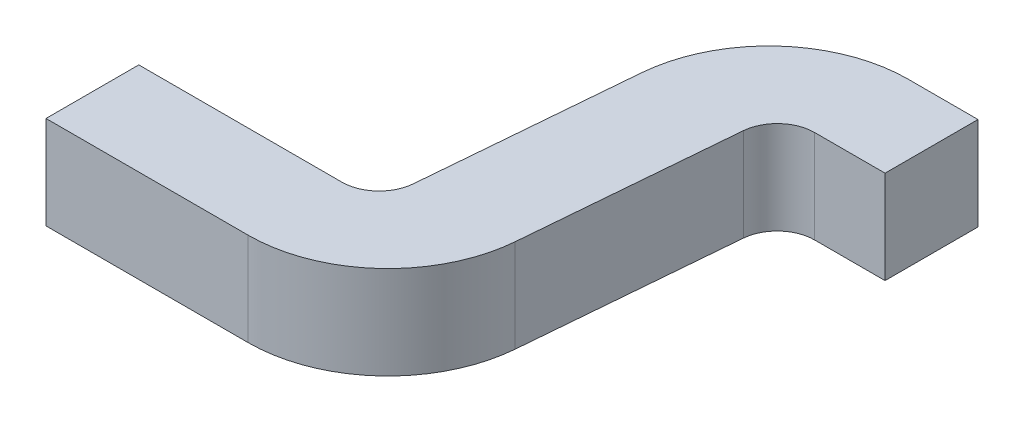
ISO-10303-21;
HEADER;
FILE_DESCRIPTION(('STEP AP214'),'2;1');
FILE_NAME('part.step','',(''),(''),'','','');
FILE_SCHEMA(('AUTOMOTIVE_DESIGN { 1 0 10303 214 1 1 1 1 }'));
ENDSEC;
DATA;
#1=APPLICATION_CONTEXT('core data for automotive mechanical design processes');
#2=APPLICATION_PROTOCOL_DEFINITION('international standard','automotive_design',2000,#1);
#3=PRODUCT_CONTEXT('',#1,'mechanical');
#4=PRODUCT('Part','Part','',(#3));
#5=PRODUCT_RELATED_PRODUCT_CATEGORY('part','',(#4));
#6=PRODUCT_DEFINITION_FORMATION('','',#4);
#7=PRODUCT_DEFINITION_CONTEXT('part definition',#1,'design');
#8=PRODUCT_DEFINITION('design','',#6,#7);
#9=PRODUCT_DEFINITION_SHAPE('','',#8);
#10=(LENGTH_UNIT() NAMED_UNIT(*) SI_UNIT(.MILLI.,.METRE.));
#11=(NAMED_UNIT(*) PLANE_ANGLE_UNIT() SI_UNIT($,.RADIAN.));
#12=(NAMED_UNIT(*) SI_UNIT($,.STERADIAN.) SOLID_ANGLE_UNIT());
#13=UNCERTAINTY_MEASURE_WITH_UNIT(LENGTH_MEASURE(1.E-05),#10,'distance_accuracy_value','');
#14=(GEOMETRIC_REPRESENTATION_CONTEXT(3) GLOBAL_UNCERTAINTY_ASSIGNED_CONTEXT((#13)) GLOBAL_UNIT_ASSIGNED_CONTEXT((#10,
#11,#12)) REPRESENTATION_CONTEXT('',''));
#15=CARTESIAN_POINT('',(0.,0.,0.));
#16=DIRECTION('',(0.,0.,1.));
#17=DIRECTION('',(1.,0.,0.));
#18=AXIS2_PLACEMENT_3D('',#15,#16,#17);
#19=CARTESIAN_POINT('',(0.,0.2,0.));
#20=DIRECTION('',(0.,1.,0.));
#21=DIRECTION('',(0.,0.,1.));
#22=AXIS2_PLACEMENT_3D('',#19,#20,#21);
#23=PLANE('',#22);
#24=DIRECTION('',(-1.,0.,0.));
#25=VECTOR('',#24,1.);
#26=CARTESIAN_POINT('',(0.778221400866666,0.2,-0.799653724513188));
#27=LINE('',#26,#25);
#28=CARTESIAN_POINT('',(0.85168691569152,0.2,-0.799653724513188));
#29=VERTEX_POINT('',#28);
#30=CARTESIAN_POINT('',(1.00325094290226,0.2,-0.799653724513188));
#31=VERTEX_POINT('',#30);
#32=EDGE_CURVE('E121',#29,#31,#27,.F.);
#33=ORIENTED_EDGE('',*,*,#32,.T.);
#34=DIRECTION('',(0.,0.,1.));
#35=VECTOR('',#34,1.);
#36=CARTESIAN_POINT('',(1.00325094290226,0.2,-0.799653724513188));
#37=LINE('',#36,#35);
#38=CARTESIAN_POINT('',(1.00325094290226,0.2,-0.99937103959104));
#39=VERTEX_POINT('',#38);
#40=EDGE_CURVE('E115',#31,#39,#37,.F.);
#41=ORIENTED_EDGE('',*,*,#40,.T.);
#42=DIRECTION('',(1.,0.,0.));
#43=VECTOR('',#42,1.);
#44=CARTESIAN_POINT('',(1.00325094290226,0.2,-0.99937103959104));
#45=LINE('',#44,#43);
#46=CARTESIAN_POINT('',(0.853746623495464,0.2,-0.99937103959104));
#47=VERTEX_POINT('',#46);
#48=EDGE_CURVE('E110',#39,#47,#45,.F.);
#49=ORIENTED_EDGE('',*,*,#48,.T.);
#50=CARTESIAN_POINT('',(0.853746623495464,0.2,-0.69937103959104));
#51=DIRECTION('',(0.,-1.,0.));
#52=DIRECTION('',(0.,0.,-1.));
#53=AXIS2_PLACEMENT_3D('',#50,#51,#52);
#54=CIRCLE('',#53,0.3);
#55=CARTESIAN_POINT('',(0.554832463240419,0.2,-0.724872506196347));
#56=VERTEX_POINT('',#55);
#57=EDGE_CURVE('E101',#56,#47,#54,.T.);
#58=ORIENTED_EDGE('',*,*,#57,.F.);
#59=DIRECTION('',(0.0850048886843567,0.,-0.996380534183482));
#60=VECTOR('',#59,1.);
#61=CARTESIAN_POINT('',(0.578250942902265,0.2,-0.999371039591039));
#62=LINE('',#61,#60);
#63=CARTESIAN_POINT('',(0.516244927909826,0.2,-0.272570648496291));
#64=VERTEX_POINT('',#63);
#65=EDGE_CURVE('E96',#56,#64,#62,.F.);
#66=ORIENTED_EDGE('',*,*,#65,.T.);
#67=CARTESIAN_POINT('',(0.436534485175147,0.2,-0.27937103959104));
#68=DIRECTION('',(0.,1.,0.));
#69=DIRECTION('',(0.,0.,1.));
#70=AXIS2_PLACEMENT_3D('',#67,#68,#69);
#71=CIRCLE('',#70,0.08);
#72=CARTESIAN_POINT('',(0.436534485175147,0.2,-0.19937103959104));
#73=VERTEX_POINT('',#72);
#74=EDGE_CURVE('E18',#64,#73,#71,.F.);
#75=ORIENTED_EDGE('',*,*,#74,.T.);
#76=DIRECTION('',(1.,0.,0.));
#77=VECTOR('',#76,1.);
#78=CARTESIAN_POINT('',(0.51,0.2,-0.19937103959104));
#79=LINE('',#78,#77);
#80=CARTESIAN_POINT('',(0.,0.2,-0.19937103959104));
#81=VERTEX_POINT('',#80);
#82=EDGE_CURVE('E143',#73,#81,#79,.F.);
#83=ORIENTED_EDGE('',*,*,#82,.T.);
#84=DIRECTION('',(0.,0.,-1.));
#85=VECTOR('',#84,1.);
#86=CARTESIAN_POINT('',(0.,0.2,-0.19937103959104));
#87=LINE('',#86,#85);
#88=CARTESIAN_POINT('',(0.,0.2,0.));
#89=VERTEX_POINT('',#88);
#90=EDGE_CURVE('E137',#81,#89,#87,.F.);
#91=ORIENTED_EDGE('',*,*,#90,.T.);
#92=DIRECTION('',(-1.,0.,0.));
#93=VECTOR('',#92,1.);
#94=CARTESIAN_POINT('',(0.,0.2,0.));
#95=LINE('',#94,#93);
#96=CARTESIAN_POINT('',(0.434504319406801,0.2,0.));
#97=VERTEX_POINT('',#96);
#98=EDGE_CURVE('E130',#89,#97,#95,.F.);
#99=ORIENTED_EDGE('',*,*,#98,.T.);
#100=CARTESIAN_POINT('',(0.434504319406801,0.2,-0.3));
#101=DIRECTION('',(0.,-1.,0.));
#102=DIRECTION('',(0.,0.,-1.));
#103=AXIS2_PLACEMENT_3D('',#100,#101,#102);
#104=CIRCLE('',#103,0.3);
#105=CARTESIAN_POINT('',(0.733418479661846,0.2,-0.274498533394693));
#106=VERTEX_POINT('',#105);
#107=EDGE_CURVE('E133',#106,#97,#104,.T.);
#108=ORIENTED_EDGE('',*,*,#107,.F.);
#109=DIRECTION('',(-0.0850048886843565,0.,0.996380534183482));
#110=VECTOR('',#109,1.);
#111=CARTESIAN_POINT('',(0.71,0.2,0.));
#112=LINE('',#111,#110);
#113=CARTESIAN_POINT('',(0.771976472956841,0.2,-0.726454115607936));
#114=VERTEX_POINT('',#113);
#115=EDGE_CURVE('E126',#106,#114,#112,.F.);
#116=ORIENTED_EDGE('',*,*,#115,.T.);
#117=CARTESIAN_POINT('',(0.85168691569152,0.2,-0.719653724513188));
#118=DIRECTION('',(0.,1.,0.));
#119=DIRECTION('',(0.,0.,1.));
#120=AXIS2_PLACEMENT_3D('',#117,#118,#119);
#121=CIRCLE('',#120,0.08);
#122=EDGE_CURVE('E160',#114,#29,#121,.F.);
#123=ORIENTED_EDGE('',*,*,#122,.T.);
#124=EDGE_LOOP('',(#33,#41,#49,#58,#66,#75,#83,#91,#99,#108,#116,#123));
#125=FACE_BOUND('',#124,.T.);
#126=ADVANCED_FACE('F15',(#125),#23,.T.);
#127=CARTESIAN_POINT('',(0.436534485175147,0.2,-0.27937103959104));
#128=DIRECTION('',(0.,1.,0.));
#129=DIRECTION('',(0.,0.,1.));
#130=AXIS2_PLACEMENT_3D('',#127,#128,#129);
#131=CYLINDRICAL_SURFACE('',#130,0.08);
#132=DIRECTION('',(0.,1.,0.));
#133=VECTOR('',#132,1.);
#134=CARTESIAN_POINT('',(0.516244927909826,0.2,-0.272570648496291));
#135=LINE('',#134,#133);
#136=CARTESIAN_POINT('',(0.516244927909826,0.,-0.272570648496291));
#137=VERTEX_POINT('',#136);
#138=EDGE_CURVE('E89',#64,#137,#135,.F.);
#139=ORIENTED_EDGE('',*,*,#138,.T.);
#140=CARTESIAN_POINT('',(0.436534485175147,0.,-0.27937103959104));
#141=DIRECTION('',(0.,1.,0.));
#142=DIRECTION('',(0.,0.,1.));
#143=AXIS2_PLACEMENT_3D('',#140,#141,#142);
#144=CIRCLE('',#143,0.08);
#145=CARTESIAN_POINT('',(0.436534485175147,0.,-0.19937103959104));
#146=VERTEX_POINT('',#145);
#147=EDGE_CURVE('E102',#137,#146,#144,.F.);
#148=ORIENTED_EDGE('',*,*,#147,.T.);
#149=DIRECTION('',(0.,1.,0.));
#150=VECTOR('',#149,1.);
#151=CARTESIAN_POINT('',(0.436534485175147,0.2,-0.19937103959104));
#152=LINE('',#151,#150);
#153=EDGE_CURVE('E90',#146,#73,#152,.T.);
#154=ORIENTED_EDGE('',*,*,#153,.T.);
#155=ORIENTED_EDGE('',*,*,#74,.F.);
#156=EDGE_LOOP('',(#139,#148,#154,#155));
#157=FACE_BOUND('',#156,.T.);
#158=ADVANCED_FACE('F87',(#157),#131,.F.);
#159=CARTESIAN_POINT('',(0.51,0.2,-0.19937103959104));
#160=DIRECTION('',(0.,0.,1.));
#161=DIRECTION('',(1.,0.,0.));
#162=AXIS2_PLACEMENT_3D('',#159,#160,#161);
#163=PLANE('',#162);
#164=ORIENTED_EDGE('',*,*,#153,.F.);
#165=DIRECTION('',(1.,0.,0.));
#166=VECTOR('',#165,1.);
#167=CARTESIAN_POINT('',(0.,0.,-0.19937103959104));
#168=LINE('',#167,#166);
#169=CARTESIAN_POINT('',(0.,0.,-0.19937103959104));
#170=VERTEX_POINT('',#169);
#171=EDGE_CURVE('E104',#146,#170,#168,.F.);
#172=ORIENTED_EDGE('',*,*,#171,.T.);
#173=DIRECTION('',(0.,1.,0.));
#174=VECTOR('',#173,1.);
#175=CARTESIAN_POINT('',(0.,0.2,-0.19937103959104));
#176=LINE('',#175,#174);
#177=EDGE_CURVE('E140',#170,#81,#176,.T.);
#178=ORIENTED_EDGE('',*,*,#177,.T.);
#179=ORIENTED_EDGE('',*,*,#82,.F.);
#180=EDGE_LOOP('',(#164,#172,#178,#179));
#181=FACE_BOUND('',#180,.T.);
#182=ADVANCED_FACE('F185',(#181),#163,.F.);
#183=CARTESIAN_POINT('',(0.,0.2,-0.19937103959104));
#184=DIRECTION('',(1.,0.,0.));
#185=DIRECTION('',(0.,0.,-1.));
#186=AXIS2_PLACEMENT_3D('',#183,#184,#185);
#187=PLANE('',#186);
#188=DIRECTION('',(0.,1.,0.));
#189=VECTOR('',#188,1.);
#190=CARTESIAN_POINT('',(0.,0.2,0.));
#191=LINE('',#190,#189);
#192=CARTESIAN_POINT('',(0.,0.,0.));
#193=VERTEX_POINT('',#192);
#194=EDGE_CURVE('E134',#193,#89,#191,.T.);
#195=ORIENTED_EDGE('',*,*,#194,.T.);
#196=ORIENTED_EDGE('',*,*,#90,.F.);
#197=ORIENTED_EDGE('',*,*,#177,.F.);
#198=DIRECTION('',(0.,0.,1.));
#199=VECTOR('',#198,1.);
#200=CARTESIAN_POINT('',(0.,0.,0.));
#201=LINE('',#200,#199);
#202=EDGE_CURVE('E174',#170,#193,#201,.T.);
#203=ORIENTED_EDGE('',*,*,#202,.T.);
#204=EDGE_LOOP('',(#195,#196,#197,#203));
#205=FACE_BOUND('',#204,.T.);
#206=ADVANCED_FACE('F190',(#205),#187,.F.);
#207=CARTESIAN_POINT('',(0.,0.2,0.));
#208=DIRECTION('',(0.,0.,-1.));
#209=DIRECTION('',(-1.,0.,0.));
#210=AXIS2_PLACEMENT_3D('',#207,#208,#209);
#211=PLANE('',#210);
#212=DIRECTION('',(0.,-1.,0.));
#213=VECTOR('',#212,1.);
#214=CARTESIAN_POINT('',(0.434504319406801,0.2,0.));
#215=LINE('',#214,#213);
#216=CARTESIAN_POINT('',(0.434504319406801,0.,0.));
#217=VERTEX_POINT('',#216);
#218=EDGE_CURVE('E161',#97,#217,#215,.T.);
#219=ORIENTED_EDGE('',*,*,#218,.F.);
#220=ORIENTED_EDGE('',*,*,#98,.F.);
#221=ORIENTED_EDGE('',*,*,#194,.F.);
#222=DIRECTION('',(1.,0.,0.));
#223=VECTOR('',#222,1.);
#224=CARTESIAN_POINT('',(0.,0.,0.));
#225=LINE('',#224,#223);
#226=EDGE_CURVE('E157',#193,#217,#225,.T.);
#227=ORIENTED_EDGE('',*,*,#226,.T.);
#228=EDGE_LOOP('',(#219,#220,#221,#227));
#229=FACE_BOUND('',#228,.T.);
#230=ADVANCED_FACE('F262',(#229),#211,.F.);
#231=CARTESIAN_POINT('',(0.434504319406801,0.2,-0.3));
#232=DIRECTION('',(0.,-1.,0.));
#233=DIRECTION('',(0.,0.,-1.));
#234=AXIS2_PLACEMENT_3D('',#231,#232,#233);
#235=CYLINDRICAL_SURFACE('',#234,0.3);
#236=CARTESIAN_POINT('',(0.434504319406801,0.,-0.3));
#237=DIRECTION('',(0.,-1.,0.));
#238=DIRECTION('',(0.,0.,-1.));
#239=AXIS2_PLACEMENT_3D('',#236,#237,#238);
#240=CIRCLE('',#239,0.3);
#241=CARTESIAN_POINT('',(0.733418479661846,0.,-0.274498533394693));
#242=VERTEX_POINT('',#241);
#243=EDGE_CURVE('E155',#217,#242,#240,.F.);
#244=ORIENTED_EDGE('',*,*,#243,.T.);
#245=DIRECTION('',(0.,1.,0.));
#246=VECTOR('',#245,1.);
#247=CARTESIAN_POINT('',(0.733418479661846,0.2,-0.274498533394693));
#248=LINE('',#247,#246);
#249=EDGE_CURVE('E129',#242,#106,#248,.T.);
#250=ORIENTED_EDGE('',*,*,#249,.T.);
#251=ORIENTED_EDGE('',*,*,#107,.T.);
#252=ORIENTED_EDGE('',*,*,#218,.T.);
#253=EDGE_LOOP('',(#244,#250,#251,#252));
#254=FACE_BOUND('',#253,.T.);
#255=ADVANCED_FACE('F264',(#254),#235,.T.);
#256=CARTESIAN_POINT('',(0.71,0.2,0.));
#257=DIRECTION('',(-0.996380534183482,0.,-0.0850048886843565));
#258=DIRECTION('',(-0.0850048886843565,0.,0.996380534183482));
#259=AXIS2_PLACEMENT_3D('',#256,#257,#258);
#260=PLANE('',#259);
#261=ORIENTED_EDGE('',*,*,#249,.F.);
#262=DIRECTION('',(0.0850048886843566,0.,-0.996380534183481));
#263=VECTOR('',#262,1.);
#264=CARTESIAN_POINT('',(0.733418479661846,0.,-0.274498533394693));
#265=LINE('',#264,#263);
#266=CARTESIAN_POINT('',(0.771976472956841,0.,-0.726454115607936));
#267=VERTEX_POINT('',#266);
#268=EDGE_CURVE('E154',#242,#267,#265,.T.);
#269=ORIENTED_EDGE('',*,*,#268,.T.);
#270=DIRECTION('',(0.,1.,0.));
#271=VECTOR('',#270,1.);
#272=CARTESIAN_POINT('',(0.771976472956841,0.2,-0.726454115607937));
#273=LINE('',#272,#271);
#274=EDGE_CURVE('E128',#267,#114,#273,.T.);
#275=ORIENTED_EDGE('',*,*,#274,.T.);
#276=ORIENTED_EDGE('',*,*,#115,.F.);
#277=EDGE_LOOP('',(#261,#269,#275,#276));
#278=FACE_BOUND('',#277,.T.);
#279=ADVANCED_FACE('F229',(#278),#260,.F.);
#280=CARTESIAN_POINT('',(0.85168691569152,0.2,-0.719653724513188));
#281=DIRECTION('',(0.,1.,0.));
#282=DIRECTION('',(0.,0.,1.));
#283=AXIS2_PLACEMENT_3D('',#280,#281,#282);
#284=CYLINDRICAL_SURFACE('',#283,0.08);
#285=ORIENTED_EDGE('',*,*,#274,.F.);
#286=CARTESIAN_POINT('',(0.85168691569152,0.,-0.719653724513188));
#287=DIRECTION('',(0.,1.,0.));
#288=DIRECTION('',(0.,0.,1.));
#289=AXIS2_PLACEMENT_3D('',#286,#287,#288);
#290=CIRCLE('',#289,0.08);
#291=CARTESIAN_POINT('',(0.85168691569152,0.,-0.799653724513188));
#292=VERTEX_POINT('',#291);
#293=EDGE_CURVE('E150',#267,#292,#290,.F.);
#294=ORIENTED_EDGE('',*,*,#293,.T.);
#295=DIRECTION('',(0.,1.,0.));
#296=VECTOR('',#295,1.);
#297=CARTESIAN_POINT('',(0.85168691569152,0.2,-0.799653724513188));
#298=LINE('',#297,#296);
#299=EDGE_CURVE('E123',#292,#29,#298,.T.);
#300=ORIENTED_EDGE('',*,*,#299,.T.);
#301=ORIENTED_EDGE('',*,*,#122,.F.);
#302=EDGE_LOOP('',(#285,#294,#300,#301));
#303=FACE_BOUND('',#302,.T.);
#304=ADVANCED_FACE('F233',(#303),#284,.F.);
#305=CARTESIAN_POINT('',(0.778221400866666,0.2,-0.799653724513188));
#306=DIRECTION('',(0.,0.,-1.));
#307=DIRECTION('',(-1.,0.,0.));
#308=AXIS2_PLACEMENT_3D('',#305,#306,#307);
#309=PLANE('',#308);
#310=ORIENTED_EDGE('',*,*,#299,.F.);
#311=DIRECTION('',(1.,0.,0.));
#312=VECTOR('',#311,1.);
#313=CARTESIAN_POINT('',(0.,0.,-0.799653724513188));
#314=LINE('',#313,#312);
#315=CARTESIAN_POINT('',(1.00325094290226,0.,-0.799653724513188));
#316=VERTEX_POINT('',#315);
#317=EDGE_CURVE('E153',#292,#316,#314,.T.);
#318=ORIENTED_EDGE('',*,*,#317,.T.);
#319=DIRECTION('',(0.,1.,0.));
#320=VECTOR('',#319,1.);
#321=CARTESIAN_POINT('',(1.00325094290226,0.2,-0.799653724513188));
#322=LINE('',#321,#320);
#323=EDGE_CURVE('E118',#316,#31,#322,.T.);
#324=ORIENTED_EDGE('',*,*,#323,.T.);
#325=ORIENTED_EDGE('',*,*,#32,.F.);
#326=EDGE_LOOP('',(#310,#318,#324,#325));
#327=FACE_BOUND('',#326,.T.);
#328=ADVANCED_FACE('F257',(#327),#309,.F.);
#329=CARTESIAN_POINT('',(1.00325094290226,0.2,-0.799653724513188));
#330=DIRECTION('',(-1.,0.,0.));
#331=DIRECTION('',(0.,0.,1.));
#332=AXIS2_PLACEMENT_3D('',#329,#330,#331);
#333=PLANE('',#332);
#334=DIRECTION('',(0.,1.,0.));
#335=VECTOR('',#334,1.);
#336=CARTESIAN_POINT('',(1.00325094290226,0.2,-0.99937103959104));
#337=LINE('',#336,#335);
#338=CARTESIAN_POINT('',(1.00325094290226,0.,-0.99937103959104));
#339=VERTEX_POINT('',#338);
#340=EDGE_CURVE('E112',#339,#39,#337,.T.);
#341=ORIENTED_EDGE('',*,*,#340,.T.);
#342=ORIENTED_EDGE('',*,*,#40,.F.);
#343=ORIENTED_EDGE('',*,*,#323,.F.);
#344=DIRECTION('',(0.,0.,1.));
#345=VECTOR('',#344,1.);
#346=CARTESIAN_POINT('',(1.00325094290226,0.,0.));
#347=LINE('',#346,#345);
#348=EDGE_CURVE('E215',#316,#339,#347,.F.);
#349=ORIENTED_EDGE('',*,*,#348,.T.);
#350=EDGE_LOOP('',(#341,#342,#343,#349));
#351=FACE_BOUND('',#350,.T.);
#352=ADVANCED_FACE('F253',(#351),#333,.F.);
#353=CARTESIAN_POINT('',(1.00325094290226,0.2,-0.99937103959104));
#354=DIRECTION('',(0.,0.,1.));
#355=DIRECTION('',(1.,0.,0.));
#356=AXIS2_PLACEMENT_3D('',#353,#354,#355);
#357=PLANE('',#356);
#358=DIRECTION('',(0.,-1.,0.));
#359=VECTOR('',#358,1.);
#360=CARTESIAN_POINT('',(0.853746623495464,0.2,-0.99937103959104));
#361=LINE('',#360,#359);
#362=CARTESIAN_POINT('',(0.853746623495464,0.,-0.99937103959104));
#363=VERTEX_POINT('',#362);
#364=EDGE_CURVE('E97',#47,#363,#361,.T.);
#365=ORIENTED_EDGE('',*,*,#364,.F.);
#366=ORIENTED_EDGE('',*,*,#48,.F.);
#367=ORIENTED_EDGE('',*,*,#340,.F.);
#368=DIRECTION('',(1.,0.,0.));
#369=VECTOR('',#368,1.);
#370=CARTESIAN_POINT('',(0.,0.,-0.99937103959104));
#371=LINE('',#370,#369);
#372=EDGE_CURVE('E149',#339,#363,#371,.F.);
#373=ORIENTED_EDGE('',*,*,#372,.T.);
#374=EDGE_LOOP('',(#365,#366,#367,#373));
#375=FACE_BOUND('',#374,.T.);
#376=ADVANCED_FACE('F248',(#375),#357,.F.);
#377=CARTESIAN_POINT('',(0.853746623495464,0.2,-0.69937103959104));
#378=DIRECTION('',(0.,-1.,0.));
#379=DIRECTION('',(0.,0.,-1.));
#380=AXIS2_PLACEMENT_3D('',#377,#378,#379);
#381=CYLINDRICAL_SURFACE('',#380,0.3);
#382=CARTESIAN_POINT('',(0.853746623495464,0.,-0.69937103959104));
#383=DIRECTION('',(0.,-1.,0.));
#384=DIRECTION('',(0.,0.,-1.));
#385=AXIS2_PLACEMENT_3D('',#382,#383,#384);
#386=CIRCLE('',#385,0.3);
#387=CARTESIAN_POINT('',(0.554832463240419,0.,-0.724872506196347));
#388=VERTEX_POINT('',#387);
#389=EDGE_CURVE('E24',#363,#388,#386,.F.);
#390=ORIENTED_EDGE('',*,*,#389,.T.);
#391=DIRECTION('',(0.,1.,0.));
#392=VECTOR('',#391,1.);
#393=CARTESIAN_POINT('',(0.554832463240419,0.2,-0.724872506196347));
#394=LINE('',#393,#392);
#395=EDGE_CURVE('E32',#388,#56,#394,.T.);
#396=ORIENTED_EDGE('',*,*,#395,.T.);
#397=ORIENTED_EDGE('',*,*,#57,.T.);
#398=ORIENTED_EDGE('',*,*,#364,.T.);
#399=EDGE_LOOP('',(#390,#396,#397,#398));
#400=FACE_BOUND('',#399,.T.);
#401=ADVANCED_FACE('F278',(#400),#381,.T.);
#402=CARTESIAN_POINT('',(0.578250942902265,0.2,-0.999371039591039));
#403=DIRECTION('',(0.996380534183482,0.,0.0850048886843567));
#404=DIRECTION('',(0.0850048886843567,0.,-0.996380534183482));
#405=AXIS2_PLACEMENT_3D('',#402,#403,#404);
#406=PLANE('',#405);
#407=ORIENTED_EDGE('',*,*,#395,.F.);
#408=DIRECTION('',(-0.0850048886843567,0.,0.996380534183481));
#409=VECTOR('',#408,1.);
#410=CARTESIAN_POINT('',(0.554832463240419,0.,-0.724872506196347));
#411=LINE('',#410,#409);
#412=EDGE_CURVE('E10',#388,#137,#411,.T.);
#413=ORIENTED_EDGE('',*,*,#412,.T.);
#414=ORIENTED_EDGE('',*,*,#138,.F.);
#415=ORIENTED_EDGE('',*,*,#65,.F.);
#416=EDGE_LOOP('',(#407,#413,#414,#415));
#417=FACE_BOUND('',#416,.T.);
#418=ADVANCED_FACE('F95',(#417),#406,.F.);
#419=CARTESIAN_POINT('',(0.,0.,0.));
#420=DIRECTION('',(0.,1.,0.));
#421=DIRECTION('',(0.,0.,1.));
#422=AXIS2_PLACEMENT_3D('',#419,#420,#421);
#423=PLANE('',#422);
#424=ORIENTED_EDGE('',*,*,#389,.F.);
#425=ORIENTED_EDGE('',*,*,#372,.F.);
#426=ORIENTED_EDGE('',*,*,#348,.F.);
#427=ORIENTED_EDGE('',*,*,#317,.F.);
#428=ORIENTED_EDGE('',*,*,#293,.F.);
#429=ORIENTED_EDGE('',*,*,#268,.F.);
#430=ORIENTED_EDGE('',*,*,#243,.F.);
#431=ORIENTED_EDGE('',*,*,#226,.F.);
#432=ORIENTED_EDGE('',*,*,#202,.F.);
#433=ORIENTED_EDGE('',*,*,#171,.F.);
#434=ORIENTED_EDGE('',*,*,#147,.F.);
#435=ORIENTED_EDGE('',*,*,#412,.F.);
#436=EDGE_LOOP('',(#424,#425,#426,#427,#428,#429,#430,#431,#432,#433,#434,#435));
#437=FACE_BOUND('',#436,.T.);
#438=ADVANCED_FACE('F195',(#437),#423,.F.);
#439=CLOSED_SHELL('',(#126,#158,#182,#206,#230,#255,#279,#304,#328,#352,#376,#401,#418,#438));
#440=MANIFOLD_SOLID_BREP('B1',#439);
#441=ADVANCED_BREP_SHAPE_REPRESENTATION('',(#18,#440),#14);
#442=SHAPE_DEFINITION_REPRESENTATION(#9,#441);
ENDSEC;
END-ISO-10303-21;
